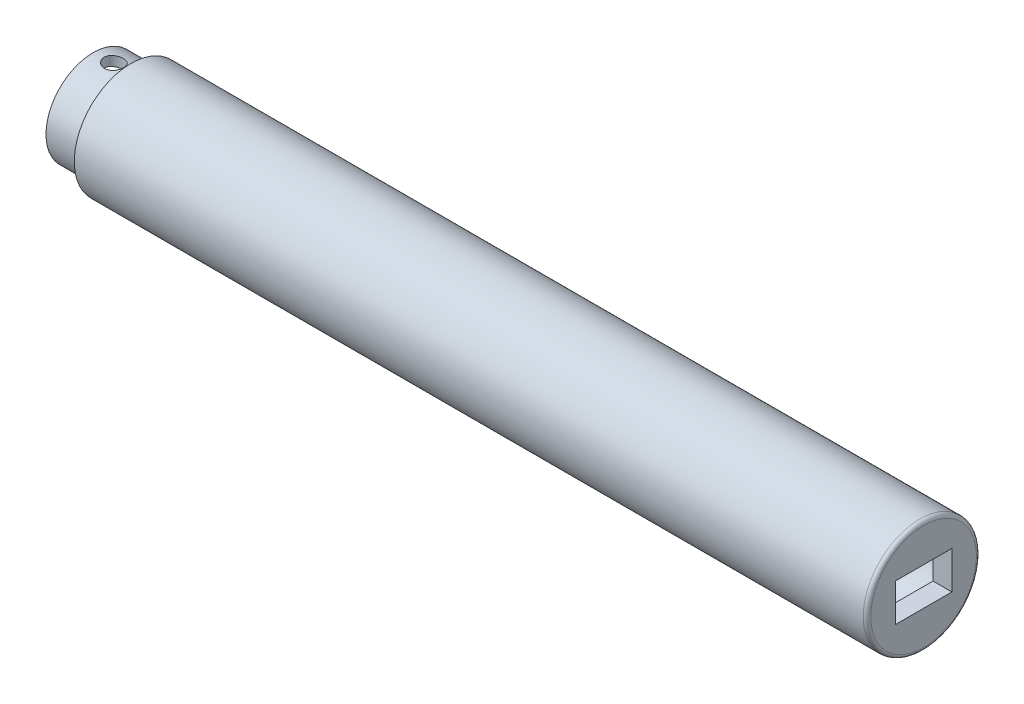
ISO-10303-21;
HEADER;
FILE_DESCRIPTION(('STEP AP214'),'2;1');
FILE_NAME('part.step','',(''),(''),'','','');
FILE_SCHEMA(('AUTOMOTIVE_DESIGN { 1 0 10303 214 1 1 1 1 }'));
ENDSEC;
DATA;
#1=APPLICATION_CONTEXT('core data for automotive mechanical design processes');
#2=APPLICATION_PROTOCOL_DEFINITION('international standard','automotive_design',2000,#1);
#3=PRODUCT_CONTEXT('',#1,'mechanical');
#4=PRODUCT('Part','Part','',(#3));
#5=PRODUCT_RELATED_PRODUCT_CATEGORY('part','',(#4));
#6=PRODUCT_DEFINITION_FORMATION('','',#4);
#7=PRODUCT_DEFINITION_CONTEXT('part definition',#1,'design');
#8=PRODUCT_DEFINITION('design','',#6,#7);
#9=PRODUCT_DEFINITION_SHAPE('','',#8);
#10=(LENGTH_UNIT() NAMED_UNIT(*) SI_UNIT(.MILLI.,.METRE.));
#11=(NAMED_UNIT(*) PLANE_ANGLE_UNIT() SI_UNIT($,.RADIAN.));
#12=(NAMED_UNIT(*) SI_UNIT($,.STERADIAN.) SOLID_ANGLE_UNIT());
#13=UNCERTAINTY_MEASURE_WITH_UNIT(LENGTH_MEASURE(1.E-05),#10,'distance_accuracy_value','');
#14=(GEOMETRIC_REPRESENTATION_CONTEXT(3) GLOBAL_UNCERTAINTY_ASSIGNED_CONTEXT((#13)) GLOBAL_UNIT_ASSIGNED_CONTEXT((#10,
#11,#12)) REPRESENTATION_CONTEXT('',''));
#15=CARTESIAN_POINT('',(0.,0.,0.));
#16=DIRECTION('',(0.,0.,1.));
#17=DIRECTION('',(1.,0.,0.));
#18=AXIS2_PLACEMENT_3D('',#15,#16,#17);
#19=CARTESIAN_POINT('',(210.,0.,0.));
#20=DIRECTION('',(-1.,0.,0.));
#21=DIRECTION('',(0.,0.,1.));
#22=AXIS2_PLACEMENT_3D('',#19,#20,#21);
#23=CYLINDRICAL_SURFACE('',#22,12.5);
#24=CARTESIAN_POINT('',(5.,0.,0.));
#25=DIRECTION('',(-1.,0.,0.));
#26=DIRECTION('',(0.,0.,1.));
#27=AXIS2_PLACEMENT_3D('',#24,#25,#26);
#28=CIRCLE('',#27,12.5);
#29=CARTESIAN_POINT('',(5.,0.,12.5));
#30=VERTEX_POINT('',#29);
#31=EDGE_CURVE('E239',#30,#30,#28,.T.);
#32=ORIENTED_EDGE('',*,*,#31,.T.);
#33=EDGE_LOOP('',(#32));
#34=FACE_BOUND('',#33,.T.);
#35=CARTESIAN_POINT('',(205.,0.,0.));
#36=DIRECTION('',(1.,0.,0.));
#37=DIRECTION('',(0.,0.,-1.));
#38=AXIS2_PLACEMENT_3D('',#35,#36,#37);
#39=CIRCLE('',#38,12.5);
#40=CARTESIAN_POINT('',(205.,0.,-12.5));
#41=VERTEX_POINT('',#40);
#42=EDGE_CURVE('E121',#41,#41,#39,.T.);
#43=ORIENTED_EDGE('',*,*,#42,.T.);
#44=EDGE_LOOP('',(#43));
#45=FACE_BOUND('',#44,.T.);
#46=ADVANCED_FACE('F51',(#34,#45),#23,.F.);
#47=CARTESIAN_POINT('',(5.,0.,0.));
#48=DIRECTION('',(-1.,0.,0.));
#49=DIRECTION('',(0.,0.,1.));
#50=AXIS2_PLACEMENT_3D('',#47,#48,#49);
#51=CYLINDRICAL_SURFACE('',#50,12.5);
#52=CARTESIAN_POINT('',(-5.,-12.1346610995116,-3.));
#53=CARTESIAN_POINT('',(-5.1380976483422,-12.134664110347,-2.99999477335943));
#54=CARTESIAN_POINT('',(-5.27625980859519,-12.1375178098362,-2.98851671921364));
#55=CARTESIAN_POINT('',(-5.5486519496931,-12.1486410905284,-2.94296588058929));
#56=CARTESIAN_POINT('',(-5.68287866293574,-12.1569150461615,-2.90887484597435));
#57=CARTESIAN_POINT('',(-5.94339631971912,-12.1780085586216,-2.81925689037975));
#58=CARTESIAN_POINT('',(-6.06969694567646,-12.1908224370799,-2.76375673947264));
#59=CARTESIAN_POINT('',(-6.31117584422771,-12.2197295326715,-2.63299714924012));
#60=CARTESIAN_POINT('',(-6.4263544469909,-12.2358226524127,-2.55773829671991));
#61=CARTESIAN_POINT('',(-6.64460125345884,-12.2700784775589,-2.38804894128161));
#62=CARTESIAN_POINT('',(-6.74741880205828,-12.2882727928939,-2.29330245701307));
#63=CARTESIAN_POINT('',(-6.93585986009478,-12.3248103594841,-2.08803726235466));
#64=CARTESIAN_POINT('',(-7.02148138771026,-12.3431536276528,-1.97751673653272));
#65=CARTESIAN_POINT('',(-7.17450018917751,-12.3786580238369,-1.74162722666089));
#66=CARTESIAN_POINT('',(-7.2415684599056,-12.3957942280208,-1.6160406843638));
#67=CARTESIAN_POINT('',(-7.35354080894954,-12.4270372651869,-1.35499224484305));
#68=CARTESIAN_POINT('',(-7.39844649809936,-12.4411443182935,-1.2195310661552));
#69=CARTESIAN_POINT('',(-7.46425457177407,-12.4650499023893,-0.944144530451727));
#70=CARTESIAN_POINT('',(-7.48542078377239,-12.4748950274651,-0.804286367869155));
#71=CARTESIAN_POINT('',(-7.50387192065023,-12.4898591684286,-0.522758447365106));
#72=CARTESIAN_POINT('',(-7.50115996341155,-12.4949788012489,-0.381088928372883));
#73=CARTESIAN_POINT('',(-7.47214430409767,-12.5003357092039,-0.102914773081256));
#74=CARTESIAN_POINT('',(-7.44630427496588,-12.5006667578049,0.0336366673237972));
#75=CARTESIAN_POINT('',(-7.37240988172887,-12.4970998294187,0.300527444047753));
#76=CARTESIAN_POINT('',(-7.32435553573769,-12.4932018558799,0.430866785432042));
#77=CARTESIAN_POINT('',(-7.20749298717128,-12.4820359916923,0.6815604861396));
#78=CARTESIAN_POINT('',(-7.13870479160742,-12.4747713460786,0.801924329146957));
#79=CARTESIAN_POINT('',(-6.98230311618649,-12.4580518278846,1.02955829036058));
#80=CARTESIAN_POINT('',(-6.8946879329632,-12.4485967571202,1.13682722243066));
#81=CARTESIAN_POINT('',(-6.70162191738673,-12.428718893,1.3368681383708));
#82=CARTESIAN_POINT('',(-6.59592992976082,-12.4182840121116,1.42940625783475));
#83=CARTESIAN_POINT('',(-6.37052049116509,-12.3980355284861,1.59553745609094));
#84=CARTESIAN_POINT('',(-6.25080251018462,-12.3882219492481,1.66912981862955));
#85=CARTESIAN_POINT('',(-5.9998529872704,-12.3705153941971,1.79568266605182));
#86=CARTESIAN_POINT('',(-5.86855573629685,-12.3626344852307,1.84851470581462));
#87=CARTESIAN_POINT('',(-5.59880119706396,-12.3499698895564,1.93132458339601));
#88=CARTESIAN_POINT('',(-5.46034447888047,-12.3451859566594,1.96130423786304));
#89=CARTESIAN_POINT('',(-5.1816945026425,-12.3394130251068,1.99730322451486));
#90=CARTESIAN_POINT('',(-5.04153285237807,-12.3383862307003,2.00356121307631));
#91=CARTESIAN_POINT('',(-4.76216168296609,-12.3401636811041,1.99258371723103));
#92=CARTESIAN_POINT('',(-4.62295212788983,-12.3429677805393,1.97534912432209));
#93=CARTESIAN_POINT('',(-4.3504053966942,-12.3519897094495,1.91811652728805));
#94=CARTESIAN_POINT('',(-4.21703484378852,-12.3581842984492,1.87827342804896));
#95=CARTESIAN_POINT('',(-3.95885632512784,-12.3731348496057,1.7771134487586));
#96=CARTESIAN_POINT('',(-3.83404891497559,-12.3818909777692,1.71579517690552));
#97=CARTESIAN_POINT('',(-3.59531922460216,-12.4008710056784,1.57277723830398));
#98=CARTESIAN_POINT('',(-3.48150365114793,-12.411107269324,1.49090111788609));
#99=CARTESIAN_POINT('',(-3.26912151359041,-12.43157471509,1.30930455815261));
#100=CARTESIAN_POINT('',(-3.17055588770841,-12.4418058968592,1.20958302174827));
#101=CARTESIAN_POINT('',(-2.99063165364597,-12.4608812281994,0.994089910217496));
#102=CARTESIAN_POINT('',(-2.90942538483626,-12.4697129348969,0.878189907044894));
#103=CARTESIAN_POINT('',(-2.76763925917367,-12.4844971389762,0.634225247426999));
#104=CARTESIAN_POINT('',(-2.70705798343907,-12.4904498344294,0.506161428558288));
#105=CARTESIAN_POINT('',(-2.60876603678924,-12.4983319774893,0.24269446333515));
#106=CARTESIAN_POINT('',(-2.57085996154865,-12.5002961592466,0.107365307946202));
#107=CARTESIAN_POINT('',(-2.51822866851604,-12.4996310077845,-0.167711373056918));
#108=CARTESIAN_POINT('',(-2.50350121150107,-12.4970021183409,-0.307458470535035));
#109=CARTESIAN_POINT('',(-2.49764698997941,-12.4870497496533,-0.585377281729211));
#110=CARTESIAN_POINT('',(-2.50620428299382,-12.4797901300213,-0.723544792587426));
#111=CARTESIAN_POINT('',(-2.54588391740362,-12.4609827587991,-0.996294650309802));
#112=CARTESIAN_POINT('',(-2.57700687246207,-12.4494348905962,-1.13087689957119));
#113=CARTESIAN_POINT('',(-2.66100772273965,-12.4227966495473,-1.39342473909799));
#114=CARTESIAN_POINT('',(-2.7139917669045,-12.4076891482106,-1.52135456650872));
#115=CARTESIAN_POINT('',(-2.84015116819116,-12.3751658629497,-1.76651670602372));
#116=CARTESIAN_POINT('',(-2.91332875885937,-12.357749823796,-1.88374783286764));
#117=CARTESIAN_POINT('',(-3.07957247090269,-12.3217115307881,-2.10676505404856));
#118=CARTESIAN_POINT('',(-3.17301450426314,-12.3030718992814,-2.21226826853601));
#119=CARTESIAN_POINT('',(-3.37638009951699,-12.2666195592813,-2.4062013527329));
#120=CARTESIAN_POINT('',(-3.48630753704835,-12.2488070465324,-2.49462719642228));
#121=CARTESIAN_POINT('',(-3.72067783697232,-12.2155870318652,-2.65254903111512));
#122=CARTESIAN_POINT('',(-3.84523193949437,-12.2002003650199,-2.72188448428906));
#123=CARTESIAN_POINT('',(-4.10460767795542,-12.1736061990787,-2.8384710359424));
#124=CARTESIAN_POINT('',(-4.23941902813878,-12.162394578152,-2.88574392751851));
#125=CARTESIAN_POINT('',(-4.47883632798108,-12.1475918845835,-2.9473226967761));
#126=CARTESIAN_POINT('',(-4.58200815306274,-12.1427698734443,-2.96703957793541));
#127=CARTESIAN_POINT('',(-4.79010761888027,-12.1363034133513,-2.99337989992059));
#128=CARTESIAN_POINT('',(-4.89503517463229,-12.1346588110453,-3.00000397264849));
#129=CARTESIAN_POINT('',(-5.,-12.1346610995116,-3.));
#130=B_SPLINE_CURVE_WITH_KNOTS('',3,(#52,#53,#54,#55,#56,#57,#58,#59,#60,#61,#62,#63,#64,#65,
#66,#67,#68,#69,#70,#71,#72,#73,#74,#75,#76,#77,#78,#79,#80,#81,#82,#83,#84,#85,#86,#87,#88,#89,
#90,#91,#92,#93,#94,#95,#96,#97,#98,#99,#100,#101,#102,#103,#104,#105,#106,#107,#108,#109,#110,
#111,#112,#113,#114,#115,#116,#117,#118,#119,#120,#121,#122,#123,#124,#125,#126,#127,#128,#129),
.UNSPECIFIED.,.T.,.F.,(4,2,2,2,2,2,2,2,2,2,2,2,2,2,2,2,2,2,2,2,2,2,2,2,2,2,2,2,2,2,2,2,2,2,2,2,
2,2,4),(0.,0.413906198067744,0.828146852288464,1.24187120806539,1.65558327820978,
2.07662359066193,2.49771239971392,2.92584894964739,3.35395437692085,3.77725341739094,
4.20049718658873,4.61544121801347,5.03038491108423,5.44492948147387,5.85951157346617,
6.28013112213003,6.70076657018751,7.12396500863862,7.54712980145622,7.96602578743332,
8.3849058775649,8.80095002779903,9.21702114676607,9.63679349282764,10.0565916542485,
10.4799349355209,10.9032490873058,11.32286070004,11.7424317727544,12.1563383248027,
12.5702561332764,12.9862078703348,13.4022056329956,13.8267054924698,14.2513053066904,
14.679373655535,15.1070182646717,15.4216339681254,15.7362344868187),.UNSPECIFIED.);
#131=CARTESIAN_POINT('',(-5.,-12.1346610995116,-3.));
#132=VERTEX_POINT('',#131);
#133=EDGE_CURVE('E133',#132,#132,#130,.T.);
#134=ORIENTED_EDGE('',*,*,#133,.T.);
#135=EDGE_LOOP('',(#134));
#136=FACE_BOUND('',#135,.T.);
#137=CARTESIAN_POINT('',(-10.,0.,0.));
#138=DIRECTION('',(-1.,0.,0.));
#139=DIRECTION('',(0.,0.,1.));
#140=AXIS2_PLACEMENT_3D('',#137,#138,#139);
#141=CIRCLE('',#140,12.5);
#142=CARTESIAN_POINT('',(-10.,0.,12.5));
#143=VERTEX_POINT('',#142);
#144=EDGE_CURVE('E243',#143,#143,#141,.T.);
#145=ORIENTED_EDGE('',*,*,#144,.F.);
#146=EDGE_LOOP('',(#145));
#147=FACE_BOUND('',#146,.T.);
#148=CARTESIAN_POINT('',(0.,0.,0.));
#149=DIRECTION('',(1.,0.,0.));
#150=DIRECTION('',(0.,0.,-1.));
#151=AXIS2_PLACEMENT_3D('',#148,#149,#150);
#152=CIRCLE('',#151,12.5);
#153=CARTESIAN_POINT('',(0.,0.,-12.5));
#154=VERTEX_POINT('',#153);
#155=EDGE_CURVE('E240',#154,#154,#152,.T.);
#156=ORIENTED_EDGE('',*,*,#155,.F.);
#157=EDGE_LOOP('',(#156));
#158=FACE_BOUND('',#157,.T.);
#159=CARTESIAN_POINT('',(-5.,12.1346610995116,-3.));
#160=CARTESIAN_POINT('',(-4.86190235165779,12.134664110347,-2.99999477335943));
#161=CARTESIAN_POINT('',(-4.72374019140481,12.1375178098362,-2.98851671921364));
#162=CARTESIAN_POINT('',(-4.45134805030689,12.1486410905284,-2.94296588058929));
#163=CARTESIAN_POINT('',(-4.31712133706425,12.1569150461615,-2.90887484597435));
#164=CARTESIAN_POINT('',(-4.05660368028088,12.1780085586216,-2.81925689037975));
#165=CARTESIAN_POINT('',(-3.93030305432354,12.1908224370799,-2.76375673947264));
#166=CARTESIAN_POINT('',(-3.68882415577228,12.2197295326715,-2.63299714924012));
#167=CARTESIAN_POINT('',(-3.57364555300909,12.2358226524127,-2.55773829671991));
#168=CARTESIAN_POINT('',(-3.35539874654115,12.2700784775589,-2.38804894128161));
#169=CARTESIAN_POINT('',(-3.25258119794171,12.2882727928939,-2.29330245701307));
#170=CARTESIAN_POINT('',(-3.06414013990521,12.3248103594841,-2.08803726235466));
#171=CARTESIAN_POINT('',(-2.97851861228973,12.3431536276528,-1.97751673653272));
#172=CARTESIAN_POINT('',(-2.82549981082248,12.3786580238369,-1.74162722666089));
#173=CARTESIAN_POINT('',(-2.7584315400944,12.3957942280208,-1.6160406843638));
#174=CARTESIAN_POINT('',(-2.64645919105045,12.4270372651869,-1.35499224484305));
#175=CARTESIAN_POINT('',(-2.60155350190064,12.4411443182935,-1.2195310661552));
#176=CARTESIAN_POINT('',(-2.53574542822592,12.4650499023893,-0.944144530451726));
#177=CARTESIAN_POINT('',(-2.51457921622761,12.4748950274651,-0.804286367869154));
#178=CARTESIAN_POINT('',(-2.49612807934976,12.4898591684286,-0.522758447365105));
#179=CARTESIAN_POINT('',(-2.49884003658844,12.4949788012489,-0.381088928372882));
#180=CARTESIAN_POINT('',(-2.52785569590232,12.5003357092039,-0.102914773081256));
#181=CARTESIAN_POINT('',(-2.55369572503411,12.5006667578049,0.0336366673237976));
#182=CARTESIAN_POINT('',(-2.62759011827112,12.4970998294187,0.300527444047753));
#183=CARTESIAN_POINT('',(-2.6756444642623,12.4932018558799,0.430866785432043));
#184=CARTESIAN_POINT('',(-2.79250701282871,12.4820359916923,0.6815604861396));
#185=CARTESIAN_POINT('',(-2.86129520839258,12.4747713460786,0.801924329146957));
#186=CARTESIAN_POINT('',(-3.01769688381351,12.4580518278846,1.02955829036058));
#187=CARTESIAN_POINT('',(-3.10531206703679,12.4485967571202,1.13682722243066));
#188=CARTESIAN_POINT('',(-3.29837808261327,12.428718893,1.3368681383708));
#189=CARTESIAN_POINT('',(-3.40407007023918,12.4182840121116,1.42940625783475));
#190=CARTESIAN_POINT('',(-3.62947950883491,12.3980355284861,1.59553745609094));
#191=CARTESIAN_POINT('',(-3.74919748981538,12.3882219492481,1.66912981862955));
#192=CARTESIAN_POINT('',(-4.00014701272959,12.3705153941971,1.79568266605182));
#193=CARTESIAN_POINT('',(-4.13144426370315,12.3626344852307,1.84851470581462));
#194=CARTESIAN_POINT('',(-4.40119880293603,12.3499698895564,1.93132458339601));
#195=CARTESIAN_POINT('',(-4.53965552111952,12.3451859566594,1.96130423786304));
#196=CARTESIAN_POINT('',(-4.8183054973575,12.3394130251068,1.99730322451486));
#197=CARTESIAN_POINT('',(-4.95846714762192,12.3383862307003,2.00356121307631));
#198=CARTESIAN_POINT('',(-5.23783831703391,12.3401636811041,1.99258371723103));
#199=CARTESIAN_POINT('',(-5.37704787211016,12.3429677805393,1.97534912432209));
#200=CARTESIAN_POINT('',(-5.64959460330579,12.3519897094495,1.91811652728805));
#201=CARTESIAN_POINT('',(-5.78296515621147,12.3581842984492,1.87827342804896));
#202=CARTESIAN_POINT('',(-6.04114367487216,12.3731348496057,1.7771134487586));
#203=CARTESIAN_POINT('',(-6.1659510850244,12.3818909777692,1.71579517690552));
#204=CARTESIAN_POINT('',(-6.40468077539784,12.4008710056784,1.57277723830398));
#205=CARTESIAN_POINT('',(-6.51849634885206,12.411107269324,1.49090111788608));
#206=CARTESIAN_POINT('',(-6.73087848640958,12.43157471509,1.3093045581526));
#207=CARTESIAN_POINT('',(-6.82944411229158,12.4418058968592,1.20958302174827));
#208=CARTESIAN_POINT('',(-7.00936834635402,12.4608812281994,0.994089910217494));
#209=CARTESIAN_POINT('',(-7.09057461516374,12.4697129348969,0.878189907044892));
#210=CARTESIAN_POINT('',(-7.23236074082633,12.4844971389762,0.634225247426996));
#211=CARTESIAN_POINT('',(-7.29294201656092,12.4904498344294,0.506161428558286));
#212=CARTESIAN_POINT('',(-7.39123396321075,12.4983319774893,0.242694463335149));
#213=CARTESIAN_POINT('',(-7.42914003845134,12.5002961592466,0.1073653079462));
#214=CARTESIAN_POINT('',(-7.48177133148395,12.4996310077845,-0.16771137305692));
#215=CARTESIAN_POINT('',(-7.49649878849892,12.4970021183409,-0.307458470535037));
#216=CARTESIAN_POINT('',(-7.50235301002059,12.4870497496533,-0.585377281729213));
#217=CARTESIAN_POINT('',(-7.49379571700617,12.4797901300213,-0.723544792587428));
#218=CARTESIAN_POINT('',(-7.45411608259637,12.4609827587991,-0.996294650309804));
#219=CARTESIAN_POINT('',(-7.42299312753792,12.4494348905962,-1.13087689957119));
#220=CARTESIAN_POINT('',(-7.33899227726034,12.4227966495473,-1.39342473909799));
#221=CARTESIAN_POINT('',(-7.28600823309549,12.4076891482106,-1.52135456650872));
#222=CARTESIAN_POINT('',(-7.15984883180883,12.3751658629497,-1.76651670602373));
#223=CARTESIAN_POINT('',(-7.08667124114062,12.357749823796,-1.88374783286764));
#224=CARTESIAN_POINT('',(-6.92042752909731,12.3217115307881,-2.10676505404856));
#225=CARTESIAN_POINT('',(-6.82698549573685,12.3030718992814,-2.21226826853601));
#226=CARTESIAN_POINT('',(-6.623619900483,12.2666195592813,-2.4062013527329));
#227=CARTESIAN_POINT('',(-6.51369246295164,12.2488070465324,-2.49462719642228));
#228=CARTESIAN_POINT('',(-6.27932216302767,12.2155870318652,-2.65254903111512));
#229=CARTESIAN_POINT('',(-6.15476806050562,12.2002003650199,-2.72188448428906));
#230=CARTESIAN_POINT('',(-5.89539232204457,12.1736061990787,-2.8384710359424));
#231=CARTESIAN_POINT('',(-5.76058097186121,12.162394578152,-2.88574392751851));
#232=CARTESIAN_POINT('',(-5.52116367201891,12.1475918845835,-2.9473226967761));
#233=CARTESIAN_POINT('',(-5.41799184693725,12.1427698734443,-2.96703957793541));
#234=CARTESIAN_POINT('',(-5.20989238111973,12.1363034133513,-2.99337989992059));
#235=CARTESIAN_POINT('',(-5.1049648253677,12.1346588110453,-3.00000397264849));
#236=CARTESIAN_POINT('',(-5.,12.1346610995116,-3.));
#237=B_SPLINE_CURVE_WITH_KNOTS('',3,(#159,#160,#161,#162,#163,#164,#165,#166,#167,#168,#169,
#170,#171,#172,#173,#174,#175,#176,#177,#178,#179,#180,#181,#182,#183,#184,#185,#186,#187,#188,
#189,#190,#191,#192,#193,#194,#195,#196,#197,#198,#199,#200,#201,#202,#203,#204,#205,#206,#207,
#208,#209,#210,#211,#212,#213,#214,#215,#216,#217,#218,#219,#220,#221,#222,#223,#224,#225,#226,
#227,#228,#229,#230,#231,#232,#233,#234,#235,#236),.UNSPECIFIED.,.T.,.F.,(4,2,2,2,2,2,2,2,2,2,2,
2,2,2,2,2,2,2,2,2,2,2,2,2,2,2,2,2,2,2,2,2,2,2,2,2,2,2,4),(0.,0.413906198067744,
0.828146852288464,1.24187120806539,1.65558327820978,2.07662359066193,2.49771239971392,
2.9258489496474,3.35395437692086,3.77725341739094,4.20049718658873,4.61544121801347,
5.03038491108423,5.44492948147387,5.85951157346617,6.28013112213003,6.70076657018751,
7.12396500863862,7.54712980145623,7.96602578743332,8.3849058775649,8.80095002779903,
9.21702114676607,9.63679349282764,10.0565916542485,10.4799349355209,10.9032490873058,
11.32286070004,11.7424317727544,12.1563383248027,12.5702561332764,12.9862078703348,
13.4022056329956,13.8267054924698,14.2513053066904,14.679373655535,15.1070182646717,
15.4216339681254,15.7362344868187),.UNSPECIFIED.);
#238=CARTESIAN_POINT('',(-5.,12.1346610995116,-3.));
#239=VERTEX_POINT('',#238);
#240=EDGE_CURVE('E145',#239,#239,#237,.T.);
#241=ORIENTED_EDGE('',*,*,#240,.T.);
#242=EDGE_LOOP('',(#241));
#243=FACE_BOUND('',#242,.T.);
#244=ADVANCED_FACE('F150',(#136,#147,#158,#243),#51,.T.);
#245=CARTESIAN_POINT('',(5.,0.,0.));
#246=DIRECTION('',(-1.,0.,0.));
#247=DIRECTION('',(0.,0.,1.));
#248=AXIS2_PLACEMENT_3D('',#245,#246,#247);
#249=CYLINDRICAL_SURFACE('',#248,10.);
#250=CARTESIAN_POINT('',(5.,0.,0.));
#251=DIRECTION('',(-1.,0.,0.));
#252=DIRECTION('',(0.,0.,1.));
#253=AXIS2_PLACEMENT_3D('',#250,#251,#252);
#254=CIRCLE('',#253,10.);
#255=CARTESIAN_POINT('',(5.,0.,10.));
#256=VERTEX_POINT('',#255);
#257=EDGE_CURVE('E250',#256,#256,#254,.T.);
#258=ORIENTED_EDGE('',*,*,#257,.F.);
#259=EDGE_LOOP('',(#258));
#260=FACE_BOUND('',#259,.T.);
#261=CARTESIAN_POINT('',(-10.,0.,0.));
#262=DIRECTION('',(-1.,0.,0.));
#263=DIRECTION('',(0.,0.,1.));
#264=AXIS2_PLACEMENT_3D('',#261,#262,#263);
#265=CIRCLE('',#264,10.);
#266=CARTESIAN_POINT('',(-10.,0.,10.));
#267=VERTEX_POINT('',#266);
#268=EDGE_CURVE('E249',#267,#267,#265,.T.);
#269=ORIENTED_EDGE('',*,*,#268,.T.);
#270=EDGE_LOOP('',(#269));
#271=FACE_BOUND('',#270,.T.);
#272=CARTESIAN_POINT('',(-5.,-9.53939201416946,-3.));
#273=CARTESIAN_POINT('',(-5.13676994789925,-9.53939488917489,-2.9999960181343));
#274=CARTESIAN_POINT('',(-5.27358275066149,-9.54295694677713,-2.98873532115892));
#275=CARTESIAN_POINT('',(-5.54324129053088,-9.55682169491491,-2.94409333087699));
#276=CARTESIAN_POINT('',(-5.6760846020695,-9.5671284221501,-2.91069879026243));
#277=CARTESIAN_POINT('',(-5.93382661721551,-9.59336105654915,-2.82302975222195));
#278=CARTESIAN_POINT('',(-6.05873836432915,-9.60927744047736,-2.76879062759023));
#279=CARTESIAN_POINT('',(-6.29767612169281,-9.64514719888088,-2.64111988981548));
#280=CARTESIAN_POINT('',(-6.41170128181909,-9.66510088824685,-2.56768677950227));
#281=CARTESIAN_POINT('',(-6.629142791124,-9.70778331907836,-2.40135356718454));
#282=CARTESIAN_POINT('',(-6.7321771571749,-9.73057368119472,-2.30797000226617));
#283=CARTESIAN_POINT('',(-6.92137157476986,-9.77638752978438,-2.10547132065662));
#284=CARTESIAN_POINT('',(-7.00752884573906,-9.79941105401611,-1.99635361683029));
#285=CARTESIAN_POINT('',(-7.16279577738127,-9.84428856790901,-1.76198031028981));
#286=CARTESIAN_POINT('',(-7.2313851580086,-9.86609450865534,-1.63636986228188));
#287=CARTESIAN_POINT('',(-7.34630574007632,-9.90592974696321,-1.37478553782942));
#288=CARTESIAN_POINT('',(-7.39263943567,-9.92395946759096,-1.2388128246445));
#289=CARTESIAN_POINT('',(-7.46084043770384,-9.95450005191991,-0.962744156398739));
#290=CARTESIAN_POINT('',(-7.48311133153706,-9.96709975044302,-0.82275799377583));
#291=CARTESIAN_POINT('',(-7.50366534937944,-9.98637475974741,-0.540640325860529));
#292=CARTESIAN_POINT('',(-7.50195341903554,-9.99305129167968,-0.398509268918795));
#293=CARTESIAN_POINT('',(-7.47488520607495,-10.0002068234768,-0.120766608125477));
#294=CARTESIAN_POINT('',(-7.45025335657271,-10.0008690487093,0.0149114680716244));
#295=CARTESIAN_POINT('',(-7.37907516799135,-9.99695201186314,0.280305116843564));
#296=CARTESIAN_POINT('',(-7.33252897338521,-9.99237278433911,0.410020728720487));
#297=CARTESIAN_POINT('',(-7.21903590372599,-9.97900546221259,0.659582433259287));
#298=CARTESIAN_POINT('',(-7.1521359950798,-9.9702270309055,0.779450449018425));
#299=CARTESIAN_POINT('',(-6.99979249911877,-9.94987337834331,1.00649459360351));
#300=CARTESIAN_POINT('',(-6.91434644169384,-9.9382977845186,1.11366902886493));
#301=CARTESIAN_POINT('',(-6.72511093343867,-9.91371905950658,1.31479406136204));
#302=CARTESIAN_POINT('',(-6.62095582532253,-9.90068990768143,1.40839759542861));
#303=CARTESIAN_POINT('',(-6.39844951368836,-9.87524377364211,1.57697458280423));
#304=CARTESIAN_POINT('',(-6.28009730802465,-9.86282683473026,1.65194671981025));
#305=CARTESIAN_POINT('',(-6.03104461638085,-9.84019286902443,1.78185808965599));
#306=CARTESIAN_POINT('',(-5.90022678333227,-9.83000049474638,1.83657709165919));
#307=CARTESIAN_POINT('',(-5.63101295528682,-9.81342621732178,1.92318181655405));
#308=CARTESIAN_POINT('',(-5.49261792036129,-9.8070438326437,1.95507042500257));
#309=CARTESIAN_POINT('',(-5.21442476185852,-9.7990628398022,1.99468666607025));
#310=CARTESIAN_POINT('',(-5.07467991877572,-9.79739301020156,2.00277409016038));
#311=CARTESIAN_POINT('',(-4.79582893878276,-9.79886719101098,1.99554883301075));
#312=CARTESIAN_POINT('',(-4.65672276168208,-9.80201089422805,1.9802376450381));
#313=CARTESIAN_POINT('',(-4.38475939612411,-9.81260823618006,1.9270269731656));
#314=CARTESIAN_POINT('',(-4.25184857531023,-9.82001165607187,1.88939052981331));
#315=CARTESIAN_POINT('',(-3.99421129359826,-9.83808730853239,1.79288391935859));
#316=CARTESIAN_POINT('',(-3.86948560625576,-9.84875984951854,1.73401174872893));
#317=CARTESIAN_POINT('',(-3.62993619440656,-9.87210411262432,1.59578177989761));
#318=CARTESIAN_POINT('',(-3.51526564908365,-9.8848004607244,1.51616276678185));
#319=CARTESIAN_POINT('',(-3.30074349660015,-9.91035306573753,1.33898992024235));
#320=CARTESIAN_POINT('',(-3.20089340636138,-9.92320933887368,1.24143425322831));
#321=CARTESIAN_POINT('',(-3.01741706610673,-9.94744707079591,1.02947205162228));
#322=CARTESIAN_POINT('',(-2.93403939592639,-9.95880518139856,0.914847335211061));
#323=CARTESIAN_POINT('',(-2.78772630096896,-9.97806743428311,0.672953130200859));
#324=CARTESIAN_POINT('',(-2.72478885681102,-9.98597191779085,0.545684892334922));
#325=CARTESIAN_POINT('',(-2.62192673920115,-9.99682039192592,0.283781524926912));
#326=CARTESIAN_POINT('',(-2.58172655005552,-9.99982464053632,0.149257232478243));
#327=CARTESIAN_POINT('',(-2.52438801086811,-10.0001601825114,-0.124618119877119));
#328=CARTESIAN_POINT('',(-2.50724609602953,-9.99749235294087,-0.263968430266362));
#329=CARTESIAN_POINT('',(-2.49658443904499,-9.98632894979507,-0.540329236501083));
#330=CARTESIAN_POINT('',(-2.50256716036802,-9.97795927856172,-0.677326007719051));
#331=CARTESIAN_POINT('',(-2.53670022726752,-9.95588272935746,-0.948079419933298));
#332=CARTESIAN_POINT('',(-2.56485120073177,-9.94217570021817,-1.08183596904376));
#333=CARTESIAN_POINT('',(-2.64252952820881,-9.9102567940205,-1.34322583244178));
#334=CARTESIAN_POINT('',(-2.69217485892095,-9.89202029492502,-1.47082096871709));
#335=CARTESIAN_POINT('',(-2.81133159750109,-9.85247526688208,-1.71585363338408));
#336=CARTESIAN_POINT('',(-2.88084645993745,-9.83116620405024,-1.83328939081067));
#337=CARTESIAN_POINT('',(-3.04032321839217,-9.78650506268282,-2.05862366515722));
#338=CARTESIAN_POINT('',(-3.13085543467864,-9.76310998331972,-2.16611026019917));
#339=CARTESIAN_POINT('',(-3.32872427247926,-9.71696430678226,-2.36453049635553));
#340=CARTESIAN_POINT('',(-3.4360653722188,-9.69421388327025,-2.45545971224725));
#341=CARTESIAN_POINT('',(-3.66666899529715,-9.65117545578334,-2.61956872849207));
#342=CARTESIAN_POINT('',(-3.79015722821877,-9.63093227837403,-2.69244382707861));
#343=CARTESIAN_POINT('',(-4.04830966885811,-9.59548076563582,-2.81618952456246));
#344=CARTESIAN_POINT('',(-4.18296417852487,-9.58026811734266,-2.86707898455657));
#345=CARTESIAN_POINT('',(-4.43125685833446,-9.55898954095725,-2.93713435421468));
#346=CARTESIAN_POINT('',(-4.54358006525458,-9.55169090031765,-2.96065357219419));
#347=CARTESIAN_POINT('',(-4.77059232108148,-9.54189121796747,-2.99208713222646));
#348=CARTESIAN_POINT('',(-4.88528108548904,-9.53938960269305,-3.00000333988071));
#349=CARTESIAN_POINT('',(-5.,-9.53939201416946,-3.));
#350=B_SPLINE_CURVE_WITH_KNOTS('',3,(#272,#273,#274,#275,#276,#277,#278,#279,#280,#281,#282,
#283,#284,#285,#286,#287,#288,#289,#290,#291,#292,#293,#294,#295,#296,#297,#298,#299,#300,#301,
#302,#303,#304,#305,#306,#307,#308,#309,#310,#311,#312,#313,#314,#315,#316,#317,#318,#319,#320,
#321,#322,#323,#324,#325,#326,#327,#328,#329,#330,#331,#332,#333,#334,#335,#336,#337,#338,#339,
#340,#341,#342,#343,#344,#345,#346,#347,#348,#349),.UNSPECIFIED.,.T.,.F.,(4,2,2,2,2,2,2,2,2,2,2,
2,2,2,2,2,2,2,2,2,2,2,2,2,2,2,2,2,2,2,2,2,2,2,2,2,2,2,4),(0.,0.409884253535154,
0.820014048340238,1.22945091351219,1.63891972513332,2.05974602851761,2.4806416066601,
2.91284675527977,3.34500345616363,3.76979368330716,4.19449631311288,4.60621532887053,
5.01793163035841,5.42870500653,5.83953312607532,6.25949702739318,6.6794905906147,
7.10392556039559,7.5283068759306,7.94623920243035,8.3641448581799,8.77722182413024,
9.19033777285226,9.60893004210803,10.0275651261442,10.4521023600252,10.8765976392165,
11.2958324498753,11.7150024396063,12.1252045293343,12.5354182379371,12.9479126231949,
13.3604787694662,13.7859180389661,14.2114708475113,14.6437795999573,15.0757167422269,
15.4195576267373,15.7633573968105),.UNSPECIFIED.);
#351=CARTESIAN_POINT('',(-5.,-9.53939201416946,-3.));
#352=VERTEX_POINT('',#351);
#353=EDGE_CURVE('E135',#352,#352,#350,.T.);
#354=ORIENTED_EDGE('',*,*,#353,.F.);
#355=EDGE_LOOP('',(#354));
#356=FACE_BOUND('',#355,.T.);
#357=CARTESIAN_POINT('',(-5.,9.53939201416946,-3.));
#358=CARTESIAN_POINT('',(-4.86323005210075,9.53939488917489,-2.9999960181343));
#359=CARTESIAN_POINT('',(-4.72641724933851,9.54295694677713,-2.98873532115892));
#360=CARTESIAN_POINT('',(-4.45675870946912,9.55682169491491,-2.94409333087699));
#361=CARTESIAN_POINT('',(-4.3239153979305,9.5671284221501,-2.91069879026243));
#362=CARTESIAN_POINT('',(-4.06617338278448,9.59336105654915,-2.82302975222195));
#363=CARTESIAN_POINT('',(-3.94126163567084,9.60927744047736,-2.76879062759023));
#364=CARTESIAN_POINT('',(-3.70232387830719,9.64514719888088,-2.64111988981548));
#365=CARTESIAN_POINT('',(-3.5882987181809,9.66510088824685,-2.56768677950227));
#366=CARTESIAN_POINT('',(-3.37085720887599,9.70778331907836,-2.40135356718454));
#367=CARTESIAN_POINT('',(-3.26782284282509,9.73057368119472,-2.30797000226617));
#368=CARTESIAN_POINT('',(-3.07862842523014,9.77638752978438,-2.10547132065662));
#369=CARTESIAN_POINT('',(-2.99247115426093,9.79941105401611,-1.99635361683029));
#370=CARTESIAN_POINT('',(-2.83720422261872,9.84428856790901,-1.76198031028981));
#371=CARTESIAN_POINT('',(-2.76861484199139,9.86609450865534,-1.63636986228188));
#372=CARTESIAN_POINT('',(-2.65369425992367,9.90592974696321,-1.37478553782941));
#373=CARTESIAN_POINT('',(-2.60736056432999,9.92395946759096,-1.2388128246445));
#374=CARTESIAN_POINT('',(-2.53915956229615,9.95450005191991,-0.962744156398738));
#375=CARTESIAN_POINT('',(-2.51688866846294,9.96709975044302,-0.822757993775829));
#376=CARTESIAN_POINT('',(-2.49633465062055,9.98637475974741,-0.540640325860529));
#377=CARTESIAN_POINT('',(-2.49804658096445,9.99305129167968,-0.398509268918795));
#378=CARTESIAN_POINT('',(-2.52511479392504,10.0002068234768,-0.120766608125477));
#379=CARTESIAN_POINT('',(-2.54974664342728,10.0008690487093,0.0149114680716247));
#380=CARTESIAN_POINT('',(-2.62092483200864,9.99695201186314,0.280305116843564));
#381=CARTESIAN_POINT('',(-2.66747102661478,9.99237278433911,0.410020728720487));
#382=CARTESIAN_POINT('',(-2.780964096274,9.97900546221259,0.659582433259287));
#383=CARTESIAN_POINT('',(-2.84786400492019,9.9702270309055,0.779450449018425));
#384=CARTESIAN_POINT('',(-3.00020750088123,9.94987337834331,1.00649459360351));
#385=CARTESIAN_POINT('',(-3.08565355830615,9.9382977845186,1.11366902886493));
#386=CARTESIAN_POINT('',(-3.27488906656132,9.91371905950658,1.31479406136204));
#387=CARTESIAN_POINT('',(-3.37904417467746,9.90068990768143,1.40839759542861));
#388=CARTESIAN_POINT('',(-3.60155048631163,9.87524377364211,1.57697458280423));
#389=CARTESIAN_POINT('',(-3.71990269197534,9.86282683473026,1.65194671981025));
#390=CARTESIAN_POINT('',(-3.96895538361915,9.84019286902443,1.78185808965599));
#391=CARTESIAN_POINT('',(-4.09977321666772,9.83000049474638,1.83657709165919));
#392=CARTESIAN_POINT('',(-4.36898704471317,9.81342621732178,1.92318181655405));
#393=CARTESIAN_POINT('',(-4.5073820796387,9.8070438326437,1.95507042500257));
#394=CARTESIAN_POINT('',(-4.78557523814147,9.7990628398022,1.99468666607025));
#395=CARTESIAN_POINT('',(-4.92532008122428,9.79739301020156,2.00277409016038));
#396=CARTESIAN_POINT('',(-5.20417106121723,9.79886719101098,1.99554883301075));
#397=CARTESIAN_POINT('',(-5.34327723831791,9.80201089422805,1.9802376450381));
#398=CARTESIAN_POINT('',(-5.61524060387588,9.81260823618006,1.9270269731656));
#399=CARTESIAN_POINT('',(-5.74815142468977,9.82001165607187,1.88939052981331));
#400=CARTESIAN_POINT('',(-6.00578870640174,9.83808730853239,1.79288391935859));
#401=CARTESIAN_POINT('',(-6.13051439374423,9.84875984951854,1.73401174872893));
#402=CARTESIAN_POINT('',(-6.37006380559343,9.87210411262432,1.59578177989761));
#403=CARTESIAN_POINT('',(-6.48473435091634,9.8848004607244,1.51616276678185));
#404=CARTESIAN_POINT('',(-6.69925650339985,9.91035306573753,1.33898992024235));
#405=CARTESIAN_POINT('',(-6.79910659363861,9.92320933887368,1.24143425322831));
#406=CARTESIAN_POINT('',(-6.98258293389326,9.94744707079591,1.02947205162228));
#407=CARTESIAN_POINT('',(-7.06596060407361,9.95880518139856,0.91484733521106));
#408=CARTESIAN_POINT('',(-7.21227369903103,9.97806743428311,0.672953130200859));
#409=CARTESIAN_POINT('',(-7.27521114318897,9.98597191779085,0.545684892334923));
#410=CARTESIAN_POINT('',(-7.37807326079885,9.99682039192592,0.283781524926913));
#411=CARTESIAN_POINT('',(-7.41827344994447,9.99982464053632,0.149257232478244));
#412=CARTESIAN_POINT('',(-7.47561198913188,10.0001601825114,-0.124618119877118));
#413=CARTESIAN_POINT('',(-7.49275390397046,9.99749235294087,-0.263968430266362));
#414=CARTESIAN_POINT('',(-7.50341556095501,9.98632894979507,-0.540329236501083));
#415=CARTESIAN_POINT('',(-7.49743283963197,9.97795927856172,-0.677326007719051));
#416=CARTESIAN_POINT('',(-7.46329977273247,9.95588272935746,-0.948079419933299));
#417=CARTESIAN_POINT('',(-7.43514879926822,9.94217570021817,-1.08183596904376));
#418=CARTESIAN_POINT('',(-7.35747047179119,9.9102567940205,-1.34322583244178));
#419=CARTESIAN_POINT('',(-7.30782514107904,9.89202029492502,-1.47082096871709));
#420=CARTESIAN_POINT('',(-7.1886684024989,9.85247526688208,-1.71585363338408));
#421=CARTESIAN_POINT('',(-7.11915354006255,9.83116620405024,-1.83328939081067));
#422=CARTESIAN_POINT('',(-6.95967678160783,9.78650506268282,-2.05862366515722));
#423=CARTESIAN_POINT('',(-6.86914456532135,9.76310998331972,-2.16611026019917));
#424=CARTESIAN_POINT('',(-6.67127572752073,9.71696430678226,-2.36453049635553));
#425=CARTESIAN_POINT('',(-6.5639346277812,9.69421388327025,-2.45545971224725));
#426=CARTESIAN_POINT('',(-6.33333100470285,9.65117545578334,-2.61956872849207));
#427=CARTESIAN_POINT('',(-6.20984277178123,9.63093227837403,-2.69244382707861));
#428=CARTESIAN_POINT('',(-5.95169033114189,9.59548076563582,-2.81618952456246));
#429=CARTESIAN_POINT('',(-5.81703582147512,9.58026811734266,-2.86707898455657));
#430=CARTESIAN_POINT('',(-5.56874314166553,9.55898954095725,-2.93713435421468));
#431=CARTESIAN_POINT('',(-5.45641993474541,9.55169090031765,-2.96065357219419));
#432=CARTESIAN_POINT('',(-5.22940767891851,9.54189121796747,-2.99208713222646));
#433=CARTESIAN_POINT('',(-5.11471891451096,9.53938960269305,-3.00000333988071));
#434=CARTESIAN_POINT('',(-5.,9.53939201416946,-3.));
#435=B_SPLINE_CURVE_WITH_KNOTS('',3,(#357,#358,#359,#360,#361,#362,#363,#364,#365,#366,#367,
#368,#369,#370,#371,#372,#373,#374,#375,#376,#377,#378,#379,#380,#381,#382,#383,#384,#385,#386,
#387,#388,#389,#390,#391,#392,#393,#394,#395,#396,#397,#398,#399,#400,#401,#402,#403,#404,#405,
#406,#407,#408,#409,#410,#411,#412,#413,#414,#415,#416,#417,#418,#419,#420,#421,#422,#423,#424,
#425,#426,#427,#428,#429,#430,#431,#432,#433,#434),.UNSPECIFIED.,.T.,.F.,(4,2,2,2,2,2,2,2,2,2,2,
2,2,2,2,2,2,2,2,2,2,2,2,2,2,2,2,2,2,2,2,2,2,2,2,2,2,2,4),(0.,0.409884253535154,
0.820014048340238,1.22945091351219,1.63891972513332,2.05974602851761,2.4806416066601,
2.91284675527977,3.34500345616363,3.76979368330716,4.19449631311288,4.60621532887053,
5.01793163035841,5.42870500653,5.83953312607533,6.25949702739319,6.67949059061471,
7.10392556039559,7.52830687593061,7.94623920243035,8.36414485817991,8.77722182413024,
9.19033777285226,9.60893004210803,10.0275651261442,10.4521023600252,10.8765976392165,
11.2958324498753,11.7150024396063,12.1252045293343,12.5354182379371,12.9479126231949,
13.3604787694662,13.7859180389661,14.2114708475113,14.6437795999573,15.0757167422269,
15.4195576267373,15.7633573968105),.UNSPECIFIED.);
#436=CARTESIAN_POINT('',(-5.,9.53939201416946,-3.));
#437=VERTEX_POINT('',#436);
#438=EDGE_CURVE('E141',#437,#437,#435,.T.);
#439=ORIENTED_EDGE('',*,*,#438,.F.);
#440=EDGE_LOOP('',(#439));
#441=FACE_BOUND('',#440,.T.);
#442=ADVANCED_FACE('F163',(#260,#271,#356,#441),#249,.F.);
#443=CARTESIAN_POINT('',(210.,0.,0.));
#444=DIRECTION('',(1.,0.,0.));
#445=DIRECTION('',(0.,0.,-1.));
#446=AXIS2_PLACEMENT_3D('',#443,#444,#445);
#447=PLANE('',#446);
#448=DIRECTION('',(0.,-1.,0.));
#449=VECTOR('',#448,1.);
#450=CARTESIAN_POINT('',(210.,-5.,7.5));
#451=LINE('',#450,#449);
#452=CARTESIAN_POINT('',(210.,5.,7.5));
#453=VERTEX_POINT('',#452);
#454=CARTESIAN_POINT('',(210.,-5.,7.5));
#455=VERTEX_POINT('',#454);
#456=EDGE_CURVE('E70',#453,#455,#451,.T.);
#457=ORIENTED_EDGE('',*,*,#456,.F.);
#458=DIRECTION('',(0.,0.,1.));
#459=VECTOR('',#458,1.);
#460=CARTESIAN_POINT('',(210.,5.,-7.5));
#461=LINE('',#460,#459);
#462=CARTESIAN_POINT('',(210.,5.,-7.5));
#463=VERTEX_POINT('',#462);
#464=EDGE_CURVE('E112',#463,#453,#461,.T.);
#465=ORIENTED_EDGE('',*,*,#464,.F.);
#466=DIRECTION('',(0.,1.,0.));
#467=VECTOR('',#466,1.);
#468=CARTESIAN_POINT('',(210.,-5.,-7.5));
#469=LINE('',#468,#467);
#470=CARTESIAN_POINT('',(210.,-5.,-7.5));
#471=VERTEX_POINT('',#470);
#472=EDGE_CURVE('E98',#471,#463,#469,.T.);
#473=ORIENTED_EDGE('',*,*,#472,.F.);
#474=DIRECTION('',(0.,0.,-1.));
#475=VECTOR('',#474,1.);
#476=CARTESIAN_POINT('',(210.,-5.,-7.5));
#477=LINE('',#476,#475);
#478=EDGE_CURVE('E106',#455,#471,#477,.T.);
#479=ORIENTED_EDGE('',*,*,#478,.F.);
#480=EDGE_LOOP('',(#457,#465,#473,#479));
#481=FACE_BOUND('',#480,.T.);
#482=CARTESIAN_POINT('',(210.,0.,0.));
#483=DIRECTION('',(1.,0.,0.));
#484=DIRECTION('',(0.,0.,-1.));
#485=AXIS2_PLACEMENT_3D('',#482,#483,#484);
#486=CIRCLE('',#485,14.);
#487=CARTESIAN_POINT('',(210.,0.,-14.));
#488=VERTEX_POINT('',#487);
#489=EDGE_CURVE('E177',#488,#488,#486,.T.);
#490=ORIENTED_EDGE('',*,*,#489,.T.);
#491=EDGE_LOOP('',(#490));
#492=FACE_BOUND('',#491,.T.);
#493=ADVANCED_FACE('F111',(#481,#492),#447,.T.);
#494=CARTESIAN_POINT('',(0.,0.,0.));
#495=DIRECTION('',(1.,0.,0.));
#496=DIRECTION('',(0.,0.,-1.));
#497=AXIS2_PLACEMENT_3D('',#494,#495,#496);
#498=PLANE('',#497);
#499=CARTESIAN_POINT('',(0.,0.,0.));
#500=DIRECTION('',(1.,0.,0.));
#501=DIRECTION('',(0.,0.,-1.));
#502=AXIS2_PLACEMENT_3D('',#499,#500,#501);
#503=CIRCLE('',#502,15.);
#504=CARTESIAN_POINT('',(0.,0.,-15.));
#505=VERTEX_POINT('',#504);
#506=EDGE_CURVE('E183',#505,#505,#503,.T.);
#507=ORIENTED_EDGE('',*,*,#506,.F.);
#508=EDGE_LOOP('',(#507));
#509=FACE_BOUND('',#508,.T.);
#510=ORIENTED_EDGE('',*,*,#155,.T.);
#511=EDGE_LOOP('',(#510));
#512=FACE_BOUND('',#511,.T.);
#513=ADVANCED_FACE('F222',(#509,#512),#498,.F.);
#514=CARTESIAN_POINT('',(210.,0.,0.));
#515=DIRECTION('',(-1.,0.,0.));
#516=DIRECTION('',(0.,0.,1.));
#517=AXIS2_PLACEMENT_3D('',#514,#515,#516);
#518=CYLINDRICAL_SURFACE('',#517,15.);
#519=CARTESIAN_POINT('',(209.,0.,0.));
#520=DIRECTION('',(1.,0.,0.));
#521=DIRECTION('',(0.,0.,-1.));
#522=AXIS2_PLACEMENT_3D('',#519,#520,#521);
#523=CIRCLE('',#522,15.);
#524=CARTESIAN_POINT('',(209.,0.,-15.));
#525=VERTEX_POINT('',#524);
#526=EDGE_CURVE('E182',#525,#525,#523,.F.);
#527=ORIENTED_EDGE('',*,*,#526,.T.);
#528=EDGE_LOOP('',(#527));
#529=FACE_BOUND('',#528,.T.);
#530=ORIENTED_EDGE('',*,*,#506,.T.);
#531=EDGE_LOOP('',(#530));
#532=FACE_BOUND('',#531,.T.);
#533=ADVANCED_FACE('F223',(#529,#532),#518,.T.);
#534=CARTESIAN_POINT('',(5.,0.,0.));
#535=DIRECTION('',(-1.,0.,0.));
#536=DIRECTION('',(0.,0.,1.));
#537=AXIS2_PLACEMENT_3D('',#534,#535,#536);
#538=PLANE('',#537);
#539=ORIENTED_EDGE('',*,*,#257,.T.);
#540=EDGE_LOOP('',(#539));
#541=FACE_BOUND('',#540,.T.);
#542=ORIENTED_EDGE('',*,*,#31,.F.);
#543=EDGE_LOOP('',(#542));
#544=FACE_BOUND('',#543,.T.);
#545=ADVANCED_FACE('F221',(#541,#544),#538,.F.);
#546=CARTESIAN_POINT('',(-10.,0.,0.));
#547=DIRECTION('',(-1.,0.,0.));
#548=DIRECTION('',(0.,0.,1.));
#549=AXIS2_PLACEMENT_3D('',#546,#547,#548);
#550=PLANE('',#549);
#551=ORIENTED_EDGE('',*,*,#268,.F.);
#552=EDGE_LOOP('',(#551));
#553=FACE_BOUND('',#552,.T.);
#554=ORIENTED_EDGE('',*,*,#144,.T.);
#555=EDGE_LOOP('',(#554));
#556=FACE_BOUND('',#555,.T.);
#557=ADVANCED_FACE('F229',(#553,#556),#550,.T.);
#558=CARTESIAN_POINT('',(-5.,300.,-0.5));
#559=DIRECTION('',(0.,-1.,0.));
#560=DIRECTION('',(0.,0.,-1.));
#561=AXIS2_PLACEMENT_3D('',#558,#559,#560);
#562=CYLINDRICAL_SURFACE('',#561,2.5);
#563=ORIENTED_EDGE('',*,*,#133,.F.);
#564=EDGE_LOOP('',(#563));
#565=FACE_BOUND('',#564,.T.);
#566=ORIENTED_EDGE('',*,*,#353,.T.);
#567=EDGE_LOOP('',(#566));
#568=FACE_BOUND('',#567,.T.);
#569=ADVANCED_FACE('F158',(#565,#568),#562,.F.);
#570=ORIENTED_EDGE('',*,*,#240,.F.);
#571=EDGE_LOOP('',(#570));
#572=FACE_BOUND('',#571,.T.);
#573=ORIENTED_EDGE('',*,*,#438,.T.);
#574=EDGE_LOOP('',(#573));
#575=FACE_BOUND('',#574,.T.);
#576=ADVANCED_FACE('F155',(#572,#575),#562,.F.);
#577=CARTESIAN_POINT('',(205.,0.,0.));
#578=DIRECTION('',(1.,0.,0.));
#579=DIRECTION('',(0.,0.,-1.));
#580=AXIS2_PLACEMENT_3D('',#577,#578,#579);
#581=PLANE('',#580);
#582=DIRECTION('',(0.,0.,1.));
#583=VECTOR('',#582,1.);
#584=CARTESIAN_POINT('',(205.,5.,0.));
#585=LINE('',#584,#583);
#586=CARTESIAN_POINT('',(205.,5.,-7.5));
#587=VERTEX_POINT('',#586);
#588=CARTESIAN_POINT('',(205.,5.,7.5));
#589=VERTEX_POINT('',#588);
#590=EDGE_CURVE('E58',#587,#589,#585,.T.);
#591=ORIENTED_EDGE('',*,*,#590,.T.);
#592=DIRECTION('',(0.,-1.,0.));
#593=VECTOR('',#592,1.);
#594=CARTESIAN_POINT('',(205.,0.,7.5));
#595=LINE('',#594,#593);
#596=CARTESIAN_POINT('',(205.,-5.,7.5));
#597=VERTEX_POINT('',#596);
#598=EDGE_CURVE('E12',#589,#597,#595,.T.);
#599=ORIENTED_EDGE('',*,*,#598,.T.);
#600=DIRECTION('',(0.,0.,-1.));
#601=VECTOR('',#600,1.);
#602=CARTESIAN_POINT('',(205.,-5.,0.));
#603=LINE('',#602,#601);
#604=CARTESIAN_POINT('',(205.,-5.,-7.5));
#605=VERTEX_POINT('',#604);
#606=EDGE_CURVE('E189',#597,#605,#603,.T.);
#607=ORIENTED_EDGE('',*,*,#606,.T.);
#608=DIRECTION('',(0.,1.,0.));
#609=VECTOR('',#608,1.);
#610=CARTESIAN_POINT('',(205.,0.,-7.5));
#611=LINE('',#610,#609);
#612=EDGE_CURVE('E100',#605,#587,#611,.T.);
#613=ORIENTED_EDGE('',*,*,#612,.T.);
#614=EDGE_LOOP('',(#591,#599,#607,#613));
#615=FACE_BOUND('',#614,.T.);
#616=ORIENTED_EDGE('',*,*,#42,.F.);
#617=EDGE_LOOP('',(#616));
#618=FACE_BOUND('',#617,.T.);
#619=ADVANCED_FACE('F160',(#615,#618),#581,.F.);
#620=CARTESIAN_POINT('',(209.,0.,0.));
#621=DIRECTION('',(1.,0.,0.));
#622=DIRECTION('',(0.,0.,-1.));
#623=AXIS2_PLACEMENT_3D('',#620,#621,#622);
#624=TOROIDAL_SURFACE('',#623,14.,1.);
#625=ORIENTED_EDGE('',*,*,#526,.F.);
#626=EDGE_LOOP('',(#625));
#627=FACE_BOUND('',#626,.T.);
#628=ORIENTED_EDGE('',*,*,#489,.F.);
#629=EDGE_LOOP('',(#628));
#630=FACE_BOUND('',#629,.T.);
#631=ADVANCED_FACE('F52',(#627,#630),#624,.T.);
#632=CARTESIAN_POINT('',(200.,-5.,7.5));
#633=DIRECTION('',(0.,0.,1.));
#634=DIRECTION('',(1.,0.,0.));
#635=AXIS2_PLACEMENT_3D('',#632,#633,#634);
#636=PLANE('',#635);
#637=DIRECTION('',(1.,0.,0.));
#638=VECTOR('',#637,1.);
#639=CARTESIAN_POINT('',(200.,5.,7.5));
#640=LINE('',#639,#638);
#641=EDGE_CURVE('E122',#589,#453,#640,.T.);
#642=ORIENTED_EDGE('',*,*,#641,.T.);
#643=ORIENTED_EDGE('',*,*,#456,.T.);
#644=DIRECTION('',(1.,0.,0.));
#645=VECTOR('',#644,1.);
#646=CARTESIAN_POINT('',(200.,-5.,7.5));
#647=LINE('',#646,#645);
#648=EDGE_CURVE('E101',#597,#455,#647,.T.);
#649=ORIENTED_EDGE('',*,*,#648,.F.);
#650=ORIENTED_EDGE('',*,*,#598,.F.);
#651=EDGE_LOOP('',(#642,#643,#649,#650));
#652=FACE_BOUND('',#651,.T.);
#653=ADVANCED_FACE('F199',(#652),#636,.F.);
#654=CARTESIAN_POINT('',(200.,5.,-7.5));
#655=DIRECTION('',(0.,1.,0.));
#656=DIRECTION('',(0.,0.,1.));
#657=AXIS2_PLACEMENT_3D('',#654,#655,#656);
#658=PLANE('',#657);
#659=DIRECTION('',(1.,0.,0.));
#660=VECTOR('',#659,1.);
#661=CARTESIAN_POINT('',(200.,5.,-7.5));
#662=LINE('',#661,#660);
#663=EDGE_CURVE('E105',#587,#463,#662,.T.);
#664=ORIENTED_EDGE('',*,*,#663,.T.);
#665=ORIENTED_EDGE('',*,*,#464,.T.);
#666=ORIENTED_EDGE('',*,*,#641,.F.);
#667=ORIENTED_EDGE('',*,*,#590,.F.);
#668=EDGE_LOOP('',(#664,#665,#666,#667));
#669=FACE_BOUND('',#668,.T.);
#670=ADVANCED_FACE('F198',(#669),#658,.F.);
#671=CARTESIAN_POINT('',(200.,-5.,-7.5));
#672=DIRECTION('',(0.,0.,-1.));
#673=DIRECTION('',(-1.,0.,0.));
#674=AXIS2_PLACEMENT_3D('',#671,#672,#673);
#675=PLANE('',#674);
#676=DIRECTION('',(1.,0.,0.));
#677=VECTOR('',#676,1.);
#678=CARTESIAN_POINT('',(200.,-5.,-7.5));
#679=LINE('',#678,#677);
#680=EDGE_CURVE('E71',#605,#471,#679,.T.);
#681=ORIENTED_EDGE('',*,*,#680,.T.);
#682=ORIENTED_EDGE('',*,*,#472,.T.);
#683=ORIENTED_EDGE('',*,*,#663,.F.);
#684=ORIENTED_EDGE('',*,*,#612,.F.);
#685=EDGE_LOOP('',(#681,#682,#683,#684));
#686=FACE_BOUND('',#685,.T.);
#687=ADVANCED_FACE('F93',(#686),#675,.F.);
#688=CARTESIAN_POINT('',(200.,-5.,-7.5));
#689=DIRECTION('',(0.,-1.,0.));
#690=DIRECTION('',(0.,0.,-1.));
#691=AXIS2_PLACEMENT_3D('',#688,#689,#690);
#692=PLANE('',#691);
#693=ORIENTED_EDGE('',*,*,#648,.T.);
#694=ORIENTED_EDGE('',*,*,#478,.T.);
#695=ORIENTED_EDGE('',*,*,#680,.F.);
#696=ORIENTED_EDGE('',*,*,#606,.F.);
#697=EDGE_LOOP('',(#693,#694,#695,#696));
#698=FACE_BOUND('',#697,.T.);
#699=ADVANCED_FACE('F110',(#698),#692,.F.);
#700=CLOSED_SHELL('',(#46,#244,#442,#493,#513,#533,#545,#557,#569,#576,#619,#631,#653,#670,#687,#699));
#701=MANIFOLD_SOLID_BREP('B2',#700);
#702=ADVANCED_BREP_SHAPE_REPRESENTATION('',(#18,#701),#14);
#703=SHAPE_DEFINITION_REPRESENTATION(#9,#702);
ENDSEC;
END-ISO-10303-21;
